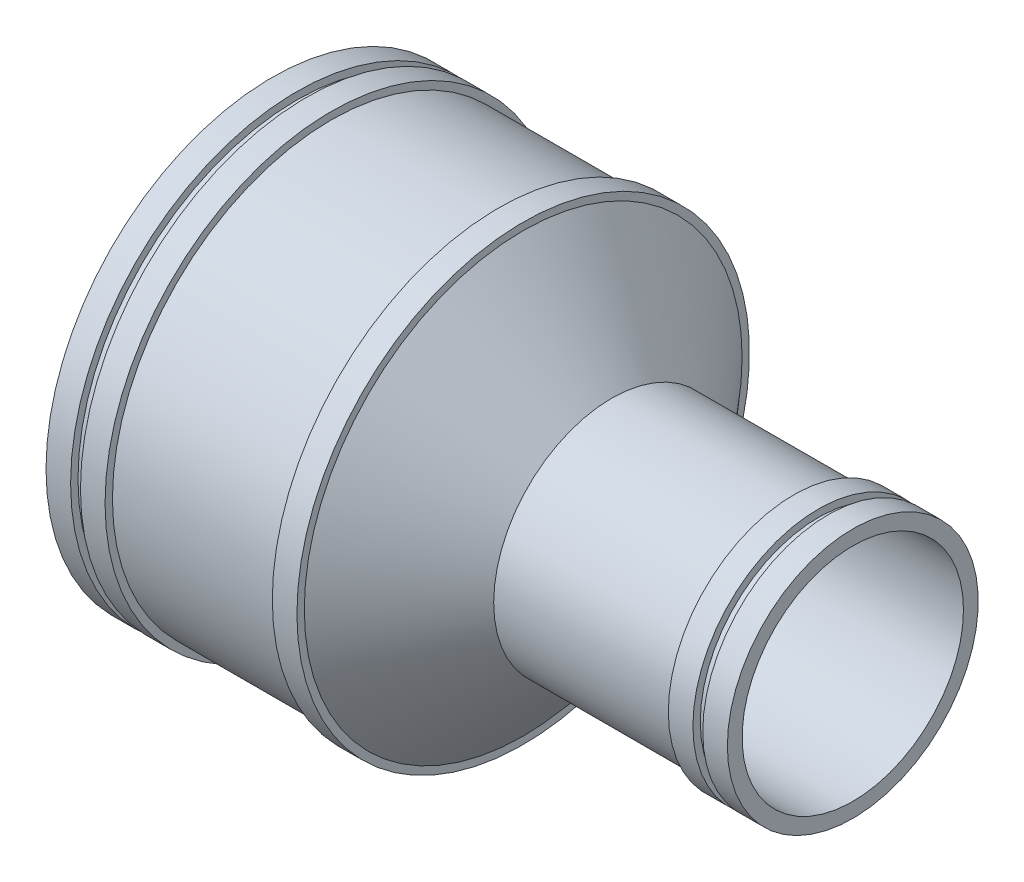
ISO-10303-21;
HEADER;
FILE_DESCRIPTION(('STEP AP214'),'2;1');
FILE_NAME('part.step','',(''),(''),'','','');
FILE_SCHEMA(('AUTOMOTIVE_DESIGN { 1 0 10303 214 1 1 1 1 }'));
ENDSEC;
DATA;
#1=APPLICATION_CONTEXT('core data for automotive mechanical design processes');
#2=APPLICATION_PROTOCOL_DEFINITION('international standard','automotive_design',2000,#1);
#3=PRODUCT_CONTEXT('',#1,'mechanical');
#4=PRODUCT('Part','Part','',(#3));
#5=PRODUCT_RELATED_PRODUCT_CATEGORY('part','',(#4));
#6=PRODUCT_DEFINITION_FORMATION('','',#4);
#7=PRODUCT_DEFINITION_CONTEXT('part definition',#1,'design');
#8=PRODUCT_DEFINITION('design','',#6,#7);
#9=PRODUCT_DEFINITION_SHAPE('','',#8);
#10=(LENGTH_UNIT() NAMED_UNIT(*) SI_UNIT(.MILLI.,.METRE.));
#11=(NAMED_UNIT(*) PLANE_ANGLE_UNIT() SI_UNIT($,.RADIAN.));
#12=(NAMED_UNIT(*) SI_UNIT($,.STERADIAN.) SOLID_ANGLE_UNIT());
#13=UNCERTAINTY_MEASURE_WITH_UNIT(LENGTH_MEASURE(1.E-05),#10,'distance_accuracy_value','');
#14=(GEOMETRIC_REPRESENTATION_CONTEXT(3) GLOBAL_UNCERTAINTY_ASSIGNED_CONTEXT((#13)) GLOBAL_UNIT_ASSIGNED_CONTEXT((#10,
#11,#12)) REPRESENTATION_CONTEXT('',''));
#15=CARTESIAN_POINT('',(0.,0.,0.));
#16=DIRECTION('',(0.,0.,1.));
#17=DIRECTION('',(1.,0.,0.));
#18=AXIS2_PLACEMENT_3D('',#15,#16,#17);
#19=CARTESIAN_POINT('',(118.,0.,0.));
#20=DIRECTION('',(-1.,0.,0.));
#21=DIRECTION('',(0.,0.,1.));
#22=AXIS2_PLACEMENT_3D('',#19,#20,#21);
#23=CYLINDRICAL_SURFACE('',#22,22.);
#24=CARTESIAN_POINT('',(69.,0.,0.));
#25=DIRECTION('',(-1.,0.,0.));
#26=DIRECTION('',(0.,0.,-1.));
#27=AXIS2_PLACEMENT_3D('',#24,#25,#26);
#28=CIRCLE('',#27,22.);
#29=CARTESIAN_POINT('',(69.,9.11626278185226,-20.0223313550699));
#30=VERTEX_POINT('',#29);
#31=EDGE_CURVE('E94',#30,#30,#28,.T.);
#32=ORIENTED_EDGE('',*,*,#31,.T.);
#33=EDGE_LOOP('',(#32));
#34=FACE_BOUND('',#33,.T.);
#35=CARTESIAN_POINT('',(79.,0.,0.));
#36=DIRECTION('',(1.,0.,0.));
#37=DIRECTION('',(0.,0.,-1.));
#38=AXIS2_PLACEMENT_3D('',#35,#36,#37);
#39=CIRCLE('',#38,22.);
#40=CARTESIAN_POINT('',(79.,0.,-22.));
#41=VERTEX_POINT('',#40);
#42=EDGE_CURVE('E46',#41,#41,#39,.T.);
#43=ORIENTED_EDGE('',*,*,#42,.T.);
#44=EDGE_LOOP('',(#43));
#45=FACE_BOUND('',#44,.T.);
#46=ADVANCED_FACE('F41',(#34,#45),#23,.F.);
#47=CARTESIAN_POINT('',(118.,0.,0.));
#48=DIRECTION('',(-1.,0.,0.));
#49=DIRECTION('',(0.,0.,1.));
#50=AXIS2_PLACEMENT_3D('',#47,#48,#49);
#51=CYLINDRICAL_SURFACE('',#50,24.);
#52=CARTESIAN_POINT('',(113.,0.,0.));
#53=DIRECTION('',(-1.,0.,0.));
#54=DIRECTION('',(0.,0.,1.));
#55=AXIS2_PLACEMENT_3D('',#52,#53,#54);
#56=CIRCLE('',#55,24.);
#57=CARTESIAN_POINT('',(113.,0.,24.));
#58=VERTEX_POINT('',#57);
#59=EDGE_CURVE('E217',#58,#58,#56,.T.);
#60=ORIENTED_EDGE('',*,*,#59,.T.);
#61=EDGE_LOOP('',(#60));
#62=FACE_BOUND('',#61,.T.);
#63=CARTESIAN_POINT('',(111.,0.,0.));
#64=DIRECTION('',(-1.,0.,0.));
#65=DIRECTION('',(0.,0.,1.));
#66=AXIS2_PLACEMENT_3D('',#63,#64,#65);
#67=CIRCLE('',#66,24.);
#68=CARTESIAN_POINT('',(111.,0.,24.));
#69=VERTEX_POINT('',#68);
#70=EDGE_CURVE('E238',#69,#69,#67,.T.);
#71=ORIENTED_EDGE('',*,*,#70,.F.);
#72=EDGE_LOOP('',(#71));
#73=FACE_BOUND('',#72,.T.);
#74=ADVANCED_FACE('F81',(#62,#73),#51,.T.);
#75=CARTESIAN_POINT('',(51.,0.,0.));
#76=DIRECTION('',(-1.,0.,0.));
#77=DIRECTION('',(0.,0.,1.));
#78=AXIS2_PLACEMENT_3D('',#75,#76,#77);
#79=CYLINDRICAL_SURFACE('',#78,44.5);
#80=CARTESIAN_POINT('',(46.,0.,0.));
#81=DIRECTION('',(-1.,0.,0.));
#82=DIRECTION('',(0.,0.,1.));
#83=AXIS2_PLACEMENT_3D('',#80,#81,#82);
#84=CIRCLE('',#83,44.5);
#85=CARTESIAN_POINT('',(46.,0.,44.5));
#86=VERTEX_POINT('',#85);
#87=EDGE_CURVE('E250',#86,#86,#84,.T.);
#88=ORIENTED_EDGE('',*,*,#87,.T.);
#89=EDGE_LOOP('',(#88));
#90=FACE_BOUND('',#89,.T.);
#91=CARTESIAN_POINT('',(12.,0.,0.));
#92=DIRECTION('',(-1.,0.,0.));
#93=DIRECTION('',(0.,0.,1.));
#94=AXIS2_PLACEMENT_3D('',#91,#92,#93);
#95=CIRCLE('',#94,44.5);
#96=CARTESIAN_POINT('',(12.,0.,44.5));
#97=VERTEX_POINT('',#96);
#98=EDGE_CURVE('E262',#97,#97,#95,.T.);
#99=ORIENTED_EDGE('',*,*,#98,.F.);
#100=EDGE_LOOP('',(#99));
#101=FACE_BOUND('',#100,.T.);
#102=ADVANCED_FACE('F282',(#90,#101),#79,.T.);
#103=CARTESIAN_POINT('',(51.,0.,0.));
#104=DIRECTION('',(-1.,0.,0.));
#105=DIRECTION('',(0.,0.,1.));
#106=AXIS2_PLACEMENT_3D('',#103,#104,#105);
#107=CYLINDRICAL_SURFACE('',#106,41.5);
#108=CARTESIAN_POINT('',(51.,0.,0.));
#109=DIRECTION('',(1.,0.,0.));
#110=DIRECTION('',(0.,0.,-1.));
#111=AXIS2_PLACEMENT_3D('',#108,#109,#110);
#112=CIRCLE('',#111,41.5);
#113=CARTESIAN_POINT('',(51.,27.3661185745552,-31.1984864082119));
#114=VERTEX_POINT('',#113);
#115=EDGE_CURVE('E55',#114,#114,#112,.T.);
#116=ORIENTED_EDGE('',*,*,#115,.T.);
#117=EDGE_LOOP('',(#116));
#118=FACE_BOUND('',#117,.T.);
#119=CARTESIAN_POINT('',(0.,0.,0.));
#120=DIRECTION('',(1.,0.,0.));
#121=DIRECTION('',(0.,0.,-1.));
#122=AXIS2_PLACEMENT_3D('',#119,#120,#121);
#123=CIRCLE('',#122,41.5);
#124=CARTESIAN_POINT('',(0.,0.,-41.5));
#125=VERTEX_POINT('',#124);
#126=EDGE_CURVE('E11',#125,#125,#123,.T.);
#127=ORIENTED_EDGE('',*,*,#126,.F.);
#128=EDGE_LOOP('',(#127));
#129=FACE_BOUND('',#128,.T.);
#130=ADVANCED_FACE('F43',(#118,#129),#107,.F.);
#131=CARTESIAN_POINT('',(5.,0.,0.));
#132=DIRECTION('',(-1.,0.,0.));
#133=DIRECTION('',(0.,0.,1.));
#134=AXIS2_PLACEMENT_3D('',#131,#132,#133);
#135=CIRCLE('',#134,44.5);
#136=CARTESIAN_POINT('',(5.,0.,44.5));
#137=VERTEX_POINT('',#136);
#138=EDGE_CURVE('E253',#137,#137,#135,.T.);
#139=ORIENTED_EDGE('',*,*,#138,.F.);
#140=EDGE_LOOP('',(#139));
#141=FACE_BOUND('',#140,.T.);
#142=CARTESIAN_POINT('',(7.,0.,0.));
#143=DIRECTION('',(-1.,0.,0.));
#144=DIRECTION('',(0.,0.,1.));
#145=AXIS2_PLACEMENT_3D('',#142,#143,#144);
#146=CIRCLE('',#145,44.5);
#147=CARTESIAN_POINT('',(7.,0.,44.5));
#148=VERTEX_POINT('',#147);
#149=EDGE_CURVE('E265',#148,#148,#146,.T.);
#150=ORIENTED_EDGE('',*,*,#149,.T.);
#151=EDGE_LOOP('',(#150));
#152=FACE_BOUND('',#151,.T.);
#153=ADVANCED_FACE('F278',(#141,#152),#79,.T.);
#154=CARTESIAN_POINT('',(0.,0.,0.));
#155=DIRECTION('',(1.,0.,0.));
#156=DIRECTION('',(0.,0.,-1.));
#157=AXIS2_PLACEMENT_3D('',#154,#155,#156);
#158=PLANE('',#157);
#159=ORIENTED_EDGE('',*,*,#126,.T.);
#160=EDGE_LOOP('',(#159));
#161=FACE_BOUND('',#160,.T.);
#162=CARTESIAN_POINT('',(0.,0.,0.));
#163=DIRECTION('',(-1.,0.,0.));
#164=DIRECTION('',(0.,0.,1.));
#165=AXIS2_PLACEMENT_3D('',#162,#163,#164);
#166=CIRCLE('',#165,46.);
#167=CARTESIAN_POINT('',(0.,0.,46.));
#168=VERTEX_POINT('',#167);
#169=EDGE_CURVE('E256',#168,#168,#166,.T.);
#170=ORIENTED_EDGE('',*,*,#169,.T.);
#171=EDGE_LOOP('',(#170));
#172=FACE_BOUND('',#171,.T.);
#173=ADVANCED_FACE('F280',(#161,#172),#158,.F.);
#174=CARTESIAN_POINT('',(69.,0.,0.));
#175=DIRECTION('',(-1.,0.,0.));
#176=DIRECTION('',(0.,0.,1.));
#177=AXIS2_PLACEMENT_3D('',#174,#175,#176);
#178=CONICAL_SURFACE('',#177,24.,0.850242190950655);
#179=CARTESIAN_POINT('',(51.,0.,0.));
#180=DIRECTION('',(-1.,0.,0.));
#181=DIRECTION('',(0.,0.,1.));
#182=AXIS2_PLACEMENT_3D('',#179,#180,#181);
#183=CIRCLE('',#182,44.5);
#184=CARTESIAN_POINT('',(51.,0.,44.5));
#185=VERTEX_POINT('',#184);
#186=EDGE_CURVE('E247',#185,#185,#183,.T.);
#187=ORIENTED_EDGE('',*,*,#186,.F.);
#188=EDGE_LOOP('',(#187));
#189=FACE_BOUND('',#188,.T.);
#190=CARTESIAN_POINT('',(69.,0.,0.));
#191=DIRECTION('',(1.,0.,0.));
#192=DIRECTION('',(0.,0.,-1.));
#193=AXIS2_PLACEMENT_3D('',#190,#191,#192);
#194=CIRCLE('',#193,24.);
#195=CARTESIAN_POINT('',(69.,0.,-24.));
#196=VERTEX_POINT('',#195);
#197=EDGE_CURVE('E50',#196,#196,#194,.T.);
#198=ORIENTED_EDGE('',*,*,#197,.F.);
#199=EDGE_LOOP('',(#198));
#200=FACE_BOUND('',#199,.T.);
#201=ADVANCED_FACE('F79',(#189,#200),#178,.T.);
#202=CARTESIAN_POINT('',(106.,0.,0.));
#203=DIRECTION('',(-1.,0.,0.));
#204=DIRECTION('',(0.,0.,1.));
#205=AXIS2_PLACEMENT_3D('',#202,#203,#204);
#206=CIRCLE('',#205,24.);
#207=CARTESIAN_POINT('',(106.,0.,24.));
#208=VERTEX_POINT('',#207);
#209=EDGE_CURVE('E229',#208,#208,#206,.T.);
#210=ORIENTED_EDGE('',*,*,#209,.T.);
#211=EDGE_LOOP('',(#210));
#212=FACE_BOUND('',#211,.T.);
#213=ORIENTED_EDGE('',*,*,#197,.T.);
#214=EDGE_LOOP('',(#213));
#215=FACE_BOUND('',#214,.T.);
#216=ADVANCED_FACE('F68',(#212,#215),#51,.T.);
#217=CARTESIAN_POINT('',(118.,0.,0.));
#218=DIRECTION('',(1.,0.,0.));
#219=DIRECTION('',(0.,0.,-1.));
#220=AXIS2_PLACEMENT_3D('',#217,#218,#219);
#221=PLANE('',#220);
#222=CARTESIAN_POINT('',(118.,0.,0.));
#223=DIRECTION('',(1.,0.,0.));
#224=DIRECTION('',(0.,0.,-1.));
#225=AXIS2_PLACEMENT_3D('',#222,#223,#224);
#226=CIRCLE('',#225,22.5);
#227=CARTESIAN_POINT('',(118.,0.,-22.5));
#228=VERTEX_POINT('',#227);
#229=EDGE_CURVE('E215',#228,#228,#226,.T.);
#230=ORIENTED_EDGE('',*,*,#229,.F.);
#231=EDGE_LOOP('',(#230));
#232=FACE_BOUND('',#231,.T.);
#233=CARTESIAN_POINT('',(118.,0.,0.));
#234=DIRECTION('',(-1.,0.,0.));
#235=DIRECTION('',(0.,0.,1.));
#236=AXIS2_PLACEMENT_3D('',#233,#234,#235);
#237=CIRCLE('',#236,25.5);
#238=CARTESIAN_POINT('',(118.,0.,25.5));
#239=VERTEX_POINT('',#238);
#240=EDGE_CURVE('E226',#239,#239,#237,.T.);
#241=ORIENTED_EDGE('',*,*,#240,.F.);
#242=EDGE_LOOP('',(#241));
#243=FACE_BOUND('',#242,.T.);
#244=ADVANCED_FACE('F78',(#232,#243),#221,.T.);
#245=CARTESIAN_POINT('',(69.,9.11626278185226,-20.0223313550699));
#246=CARTESIAN_POINT('',(51.,27.3661185745552,-31.1984864082119));
#247=CARTESIAN_POINT('',(69.,-30.9283999282875,-38.2548569187744));
#248=CARTESIAN_POINT('',(51.,-35.0308542418687,-85.9307235573223));
#249=CARTESIAN_POINT('',(69.,-49.1609254919921,1.7898057913654));
#250=CARTESIAN_POINT('',(51.,-89.7630913909791,-23.5337507408984));
#251=CARTESIAN_POINT('',(69.,-9.11626278185225,20.0223313550699));
#252=CARTESIAN_POINT('',(51.,-27.3661185745552,31.198486408212));
#253=CARTESIAN_POINT('',(69.,30.9283999282875,38.2548569187744));
#254=CARTESIAN_POINT('',(51.,35.0308542418687,85.9307235573223));
#255=CARTESIAN_POINT('',(69.,49.1609254919921,-1.78980579136539));
#256=CARTESIAN_POINT('',(51.,89.7630913909791,23.5337507408984));
#257=CARTESIAN_POINT('',(69.,9.11626278185226,-20.0223313550699));
#258=CARTESIAN_POINT('',(51.,27.3661185745552,-31.1984864082119));
#259=(BOUNDED_SURFACE() B_SPLINE_SURFACE(3,1,((#245,#246),(#247,#248),(#249,#250),(#251,#252),
(#253,#254),(#255,#256),(#257,#258)),.UNSPECIFIED.,.T.,.F.,.F.) B_SPLINE_SURFACE_WITH_KNOTS((4,
3,4),(2,2),(0.,0.5,1.),(0.,1.),
.UNSPECIFIED.) GEOMETRIC_REPRESENTATION_ITEM() RATIONAL_B_SPLINE_SURFACE(((1.,1.),
(0.333333333333333,0.333333333333333),(0.333333333333333,0.333333333333333),(1.,1.),
(0.333333333333333,0.333333333333333),(0.333333333333333,0.333333333333333),(1.,1.))) REPRESENTATION_ITEM('') SURFACE());
#260=CARTESIAN_POINT('',(69.,9.11626278185226,-20.0223313550699));
#261=CARTESIAN_POINT('',(68.8125,9.30636544635958,-20.1387496368735));
#262=CARTESIAN_POINT('',(68.625,9.4964681108669,-20.255167918677));
#263=CARTESIAN_POINT('',(68.25,9.87667343988154,-20.4880044822842));
#264=CARTESIAN_POINT('',(68.0625,10.0667761043889,-20.6044227640877));
#265=CARTESIAN_POINT('',(67.6875,10.4469814334035,-20.8372593276948));
#266=CARTESIAN_POINT('',(67.5,10.6370840979108,-20.9536776094984));
#267=CARTESIAN_POINT('',(67.125,11.0172894269255,-21.1865141731055));
#268=CARTESIAN_POINT('',(66.9375,11.2073920914328,-21.3029324549091));
#269=CARTESIAN_POINT('',(66.5625,11.5875974204474,-21.5357690185162));
#270=CARTESIAN_POINT('',(66.375,11.7777000849548,-21.6521873003198));
#271=CARTESIAN_POINT('',(66.,12.1579054139694,-21.8850238639269));
#272=CARTESIAN_POINT('',(65.8125,12.3480080784767,-22.0014421457305));
#273=CARTESIAN_POINT('',(65.4375,12.7282134074914,-22.2342787093376));
#274=CARTESIAN_POINT('',(65.25,12.9183160719987,-22.3506969911412));
#275=CARTESIAN_POINT('',(64.875,13.2985214010133,-22.5835335547483));
#276=CARTESIAN_POINT('',(64.6875,13.4886240655207,-22.6999518365518));
#277=CARTESIAN_POINT('',(64.3125,13.8688293945353,-22.932788400159));
#278=CARTESIAN_POINT('',(64.125,14.0589320590426,-23.0492066819625));
#279=CARTESIAN_POINT('',(63.75,14.4391373880573,-23.2820432455697));
#280=CARTESIAN_POINT('',(63.5625,14.6292400525646,-23.3984615273732));
#281=CARTESIAN_POINT('',(63.1875,15.0094453815792,-23.6312980909804));
#282=CARTESIAN_POINT('',(63.,15.1995480460866,-23.7477163727839));
#283=CARTESIAN_POINT('',(62.625,15.5797533751012,-23.980552936391));
#284=CARTESIAN_POINT('',(62.4375,15.7698560396085,-24.0969712181946));
#285=CARTESIAN_POINT('',(62.0625,16.1500613686232,-24.3298077818017));
#286=CARTESIAN_POINT('',(61.875,16.3401640331305,-24.4462260636053));
#287=CARTESIAN_POINT('',(61.5,16.7203693621451,-24.6790626272124));
#288=CARTESIAN_POINT('',(61.3125,16.9104720266525,-24.795480909016));
#289=CARTESIAN_POINT('',(60.9375,17.2906773556671,-25.0283174726231));
#290=CARTESIAN_POINT('',(60.75,17.4807800201744,-25.1447357544267));
#291=CARTESIAN_POINT('',(60.375,17.8609853491891,-25.3775723180338));
#292=CARTESIAN_POINT('',(60.1875,18.0510880136964,-25.4939905998374));
#293=CARTESIAN_POINT('',(59.8125,18.431293342711,-25.7268271634445));
#294=CARTESIAN_POINT('',(59.625,18.6213960072184,-25.8432454452481));
#295=CARTESIAN_POINT('',(59.25,19.001601336233,-26.0760820088552));
#296=CARTESIAN_POINT('',(59.0625,19.1917040007403,-26.1925002906587));
#297=CARTESIAN_POINT('',(58.6875,19.571909329755,-26.4253368542659));
#298=CARTESIAN_POINT('',(58.5,19.7620119942623,-26.5417551360694));
#299=CARTESIAN_POINT('',(58.125,20.1422173232769,-26.7745916996766));
#300=CARTESIAN_POINT('',(57.9375,20.3323199877843,-26.8910099814801));
#301=CARTESIAN_POINT('',(57.5625,20.7125253167989,-27.1238465450872));
#302=CARTESIAN_POINT('',(57.375,20.9026279813062,-27.2402648268908));
#303=CARTESIAN_POINT('',(57.,21.2828333103209,-27.4731013904979));
#304=CARTESIAN_POINT('',(56.8125,21.4729359748282,-27.5895196723015));
#305=CARTESIAN_POINT('',(56.4375,21.8531413038428,-27.8223562359086));
#306=CARTESIAN_POINT('',(56.25,22.0432439683502,-27.9387745177122));
#307=CARTESIAN_POINT('',(55.875,22.4234492973648,-28.1716110813193));
#308=CARTESIAN_POINT('',(55.6875,22.6135519618721,-28.2880293631229));
#309=CARTESIAN_POINT('',(55.3125,22.9937572908868,-28.52086592673));
#310=CARTESIAN_POINT('',(55.125,23.1838599553941,-28.6372842085336));
#311=CARTESIAN_POINT('',(54.75,23.5640652844087,-28.8701207721407));
#312=CARTESIAN_POINT('',(54.5625,23.7541679489161,-28.9865390539443));
#313=CARTESIAN_POINT('',(54.1875,24.1343732779307,-29.2193756175514));
#314=CARTESIAN_POINT('',(54.,24.324475942438,-29.3357938993549));
#315=CARTESIAN_POINT('',(53.625,24.7046812714527,-29.5686304629621));
#316=CARTESIAN_POINT('',(53.4375,24.89478393596,-29.6850487447656));
#317=CARTESIAN_POINT('',(53.0625,25.2749892649746,-29.9178853083728));
#318=CARTESIAN_POINT('',(52.875,25.465091929482,-30.0343035901763));
#319=CARTESIAN_POINT('',(52.5,25.8452972584966,-30.2671401537834));
#320=CARTESIAN_POINT('',(52.3125,26.0353999230039,-30.383558435587));
#321=CARTESIAN_POINT('',(51.9375,26.4156052520186,-30.6163949991941));
#322=CARTESIAN_POINT('',(51.75,26.6057079165259,-30.7328132809977));
#323=CARTESIAN_POINT('',(51.375,26.9859132455406,-30.9656498446048));
#324=CARTESIAN_POINT('',(51.1875,27.1760159100479,-31.0820681264084));
#325=CARTESIAN_POINT('',(51.,27.3661185745552,-31.1984864082119));
#326=B_SPLINE_CURVE_WITH_KNOTS('',3,(#260,#261,#262,#263,#264,#265,#266,#267,#268,#269,#270,
#271,#272,#273,#274,#275,#276,#277,#278,#279,#280,#281,#282,#283,#284,#285,#286,#287,#288,#289,
#290,#291,#292,#293,#294,#295,#296,#297,#298,#299,#300,#301,#302,#303,#304,#305,#306,#307,#308,
#309,#310,#311,#312,#313,#314,#315,#316,#317,#318,#319,#320,#321,#322,#323,#324,#325),
.UNSPECIFIED.,.F.,.F.,(4,2,2,2,2,2,2,2,2,2,2,2,2,2,2,2,2,2,2,2,2,2,2,2,2,2,2,2,2,2,2,2,4),(0.,
0.873862920896573,1.74772584179315,2.62158876268973,3.49545168358631,4.36931460448288,
5.24317752537946,6.11704044627604,6.99090336717261,7.86476628806918,8.73862920896576,
9.61249212986235,10.4863550507589,11.3602179716555,12.2340808925521,13.1079438134487,
13.9818067343452,14.8556696552418,15.7295325761384,16.603395497035,17.4772584179315,
18.3511213388281,19.2249842597247,20.0988471806213,20.9727101015178,21.8465730224144,
22.720435943311,23.5942988642076,24.4681617851041,25.3420247060007,26.2158876268973,
27.0897505477939,27.9636134686905),.UNSPECIFIED.);
#327=EDGE_CURVE('BSEAM124',#30,#114,#326,.T.);
#328=ORIENTED_EDGE('',*,*,#31,.F.);
#329=ORIENTED_EDGE('',*,*,#115,.F.);
#330=ORIENTED_EDGE('',*,*,#327,.T.);
#331=ORIENTED_EDGE('',*,*,#327,.F.);
#332=EDGE_LOOP('',(#328,#330,#329,#331));
#333=FACE_BOUND('',#332,.T.);
#334=ADVANCED_FACE('F124',(#333),#259,.F.);
#335=CARTESIAN_POINT('',(12.,0.,0.));
#336=DIRECTION('',(1.,0.,0.));
#337=DIRECTION('',(0.,0.,-1.));
#338=AXIS2_PLACEMENT_3D('',#335,#336,#337);
#339=PLANE('',#338);
#340=ORIENTED_EDGE('',*,*,#98,.T.);
#341=EDGE_LOOP('',(#340));
#342=FACE_BOUND('',#341,.T.);
#343=CARTESIAN_POINT('',(12.,0.,0.));
#344=DIRECTION('',(-1.,0.,0.));
#345=DIRECTION('',(0.,0.,1.));
#346=AXIS2_PLACEMENT_3D('',#343,#344,#345);
#347=CIRCLE('',#346,46.);
#348=CARTESIAN_POINT('',(12.,0.,46.));
#349=VERTEX_POINT('',#348);
#350=EDGE_CURVE('E102',#349,#349,#347,.T.);
#351=ORIENTED_EDGE('',*,*,#350,.F.);
#352=EDGE_LOOP('',(#351));
#353=FACE_BOUND('',#352,.T.);
#354=ADVANCED_FACE('F141',(#342,#353),#339,.T.);
#355=CARTESIAN_POINT('',(0.,0.,0.));
#356=DIRECTION('',(-1.,0.,0.));
#357=DIRECTION('',(0.,0.,1.));
#358=AXIS2_PLACEMENT_3D('',#355,#356,#357);
#359=CYLINDRICAL_SURFACE('',#358,46.);
#360=ORIENTED_EDGE('',*,*,#350,.T.);
#361=EDGE_LOOP('',(#360));
#362=FACE_BOUND('',#361,.T.);
#363=CARTESIAN_POINT('',(7.,0.,0.));
#364=DIRECTION('',(-1.,0.,0.));
#365=DIRECTION('',(0.,0.,1.));
#366=AXIS2_PLACEMENT_3D('',#363,#364,#365);
#367=CIRCLE('',#366,46.);
#368=CARTESIAN_POINT('',(7.,0.,46.));
#369=VERTEX_POINT('',#368);
#370=EDGE_CURVE('E268',#369,#369,#367,.T.);
#371=ORIENTED_EDGE('',*,*,#370,.F.);
#372=EDGE_LOOP('',(#371));
#373=FACE_BOUND('',#372,.T.);
#374=ADVANCED_FACE('F151',(#362,#373),#359,.T.);
#375=CARTESIAN_POINT('',(7.,0.,0.));
#376=DIRECTION('',(-1.,0.,0.));
#377=DIRECTION('',(0.,0.,1.));
#378=AXIS2_PLACEMENT_3D('',#375,#376,#377);
#379=PLANE('',#378);
#380=ORIENTED_EDGE('',*,*,#370,.T.);
#381=EDGE_LOOP('',(#380));
#382=FACE_BOUND('',#381,.T.);
#383=ORIENTED_EDGE('',*,*,#149,.F.);
#384=EDGE_LOOP('',(#383));
#385=FACE_BOUND('',#384,.T.);
#386=ADVANCED_FACE('F155',(#382,#385),#379,.T.);
#387=CARTESIAN_POINT('',(5.,0.,0.));
#388=DIRECTION('',(1.,0.,0.));
#389=DIRECTION('',(0.,0.,-1.));
#390=AXIS2_PLACEMENT_3D('',#387,#388,#389);
#391=PLANE('',#390);
#392=ORIENTED_EDGE('',*,*,#138,.T.);
#393=EDGE_LOOP('',(#392));
#394=FACE_BOUND('',#393,.T.);
#395=CARTESIAN_POINT('',(5.,0.,0.));
#396=DIRECTION('',(-1.,0.,0.));
#397=DIRECTION('',(0.,0.,1.));
#398=AXIS2_PLACEMENT_3D('',#395,#396,#397);
#399=CIRCLE('',#398,46.);
#400=CARTESIAN_POINT('',(5.,0.,46.));
#401=VERTEX_POINT('',#400);
#402=EDGE_CURVE('E259',#401,#401,#399,.T.);
#403=ORIENTED_EDGE('',*,*,#402,.F.);
#404=EDGE_LOOP('',(#403));
#405=FACE_BOUND('',#404,.T.);
#406=ADVANCED_FACE('F159',(#394,#405),#391,.T.);
#407=CARTESIAN_POINT('',(0.,0.,0.));
#408=DIRECTION('',(-1.,0.,0.));
#409=DIRECTION('',(0.,0.,1.));
#410=AXIS2_PLACEMENT_3D('',#407,#408,#409);
#411=CYLINDRICAL_SURFACE('',#410,46.);
#412=ORIENTED_EDGE('',*,*,#402,.T.);
#413=EDGE_LOOP('',(#412));
#414=FACE_BOUND('',#413,.T.);
#415=ORIENTED_EDGE('',*,*,#169,.F.);
#416=EDGE_LOOP('',(#415));
#417=FACE_BOUND('',#416,.T.);
#418=ADVANCED_FACE('F163',(#414,#417),#411,.T.);
#419=CARTESIAN_POINT('',(46.,0.,0.));
#420=DIRECTION('',(-1.,0.,0.));
#421=DIRECTION('',(0.,0.,1.));
#422=AXIS2_PLACEMENT_3D('',#419,#420,#421);
#423=PLANE('',#422);
#424=CARTESIAN_POINT('',(46.,0.,0.));
#425=DIRECTION('',(-1.,0.,0.));
#426=DIRECTION('',(0.,0.,1.));
#427=AXIS2_PLACEMENT_3D('',#424,#425,#426);
#428=CIRCLE('',#427,46.);
#429=CARTESIAN_POINT('',(46.,0.,46.));
#430=VERTEX_POINT('',#429);
#431=EDGE_CURVE('E241',#430,#430,#428,.T.);
#432=ORIENTED_EDGE('',*,*,#431,.T.);
#433=EDGE_LOOP('',(#432));
#434=FACE_BOUND('',#433,.T.);
#435=ORIENTED_EDGE('',*,*,#87,.F.);
#436=EDGE_LOOP('',(#435));
#437=FACE_BOUND('',#436,.T.);
#438=ADVANCED_FACE('F167',(#434,#437),#423,.T.);
#439=CARTESIAN_POINT('',(51.,0.,0.));
#440=DIRECTION('',(-1.,0.,0.));
#441=DIRECTION('',(0.,0.,1.));
#442=AXIS2_PLACEMENT_3D('',#439,#440,#441);
#443=PLANE('',#442);
#444=CARTESIAN_POINT('',(51.,0.,0.));
#445=DIRECTION('',(-1.,0.,0.));
#446=DIRECTION('',(0.,0.,1.));
#447=AXIS2_PLACEMENT_3D('',#444,#445,#446);
#448=CIRCLE('',#447,46.);
#449=CARTESIAN_POINT('',(51.,0.,46.));
#450=VERTEX_POINT('',#449);
#451=EDGE_CURVE('E244',#450,#450,#448,.T.);
#452=ORIENTED_EDGE('',*,*,#451,.F.);
#453=EDGE_LOOP('',(#452));
#454=FACE_BOUND('',#453,.T.);
#455=ORIENTED_EDGE('',*,*,#186,.T.);
#456=EDGE_LOOP('',(#455));
#457=FACE_BOUND('',#456,.T.);
#458=ADVANCED_FACE('F171',(#454,#457),#443,.F.);
#459=CARTESIAN_POINT('',(0.,0.,0.));
#460=DIRECTION('',(-1.,0.,0.));
#461=DIRECTION('',(0.,0.,1.));
#462=AXIS2_PLACEMENT_3D('',#459,#460,#461);
#463=CYLINDRICAL_SURFACE('',#462,46.);
#464=ORIENTED_EDGE('',*,*,#431,.F.);
#465=EDGE_LOOP('',(#464));
#466=FACE_BOUND('',#465,.T.);
#467=ORIENTED_EDGE('',*,*,#451,.T.);
#468=EDGE_LOOP('',(#467));
#469=FACE_BOUND('',#468,.T.);
#470=ADVANCED_FACE('F175',(#466,#469),#463,.T.);
#471=CARTESIAN_POINT('',(111.,1.02695629777826E-12,0.));
#472=DIRECTION('',(1.,0.,0.));
#473=DIRECTION('',(0.,0.,-1.));
#474=AXIS2_PLACEMENT_3D('',#471,#472,#473);
#475=PLANE('',#474);
#476=ORIENTED_EDGE('',*,*,#70,.T.);
#477=EDGE_LOOP('',(#476));
#478=FACE_BOUND('',#477,.T.);
#479=CARTESIAN_POINT('',(111.,0.,0.));
#480=DIRECTION('',(-1.,0.,0.));
#481=DIRECTION('',(0.,0.,1.));
#482=AXIS2_PLACEMENT_3D('',#479,#480,#481);
#483=CIRCLE('',#482,25.5);
#484=CARTESIAN_POINT('',(111.,0.,25.5));
#485=VERTEX_POINT('',#484);
#486=EDGE_CURVE('E235',#485,#485,#483,.T.);
#487=ORIENTED_EDGE('',*,*,#486,.F.);
#488=EDGE_LOOP('',(#487));
#489=FACE_BOUND('',#488,.T.);
#490=ADVANCED_FACE('F179',(#478,#489),#475,.T.);
#491=CARTESIAN_POINT('',(0.,0.,0.));
#492=DIRECTION('',(-1.,0.,0.));
#493=DIRECTION('',(0.,0.,1.));
#494=AXIS2_PLACEMENT_3D('',#491,#492,#493);
#495=CYLINDRICAL_SURFACE('',#494,25.5);
#496=ORIENTED_EDGE('',*,*,#486,.T.);
#497=EDGE_LOOP('',(#496));
#498=FACE_BOUND('',#497,.T.);
#499=CARTESIAN_POINT('',(106.,0.,0.));
#500=DIRECTION('',(-1.,0.,0.));
#501=DIRECTION('',(0.,0.,1.));
#502=AXIS2_PLACEMENT_3D('',#499,#500,#501);
#503=CIRCLE('',#502,25.5);
#504=CARTESIAN_POINT('',(106.,0.,25.5));
#505=VERTEX_POINT('',#504);
#506=EDGE_CURVE('E232',#505,#505,#503,.T.);
#507=ORIENTED_EDGE('',*,*,#506,.F.);
#508=EDGE_LOOP('',(#507));
#509=FACE_BOUND('',#508,.T.);
#510=ADVANCED_FACE('F183',(#498,#509),#495,.T.);
#511=CARTESIAN_POINT('',(106.,0.,0.));
#512=DIRECTION('',(-1.,0.,0.));
#513=DIRECTION('',(0.,0.,1.));
#514=AXIS2_PLACEMENT_3D('',#511,#512,#513);
#515=PLANE('',#514);
#516=ORIENTED_EDGE('',*,*,#506,.T.);
#517=EDGE_LOOP('',(#516));
#518=FACE_BOUND('',#517,.T.);
#519=ORIENTED_EDGE('',*,*,#209,.F.);
#520=EDGE_LOOP('',(#519));
#521=FACE_BOUND('',#520,.T.);
#522=ADVANCED_FACE('F187',(#518,#521),#515,.T.);
#523=CARTESIAN_POINT('',(0.,0.,0.));
#524=DIRECTION('',(-1.,0.,0.));
#525=DIRECTION('',(0.,0.,1.));
#526=AXIS2_PLACEMENT_3D('',#523,#524,#525);
#527=CYLINDRICAL_SURFACE('',#526,25.5);
#528=ORIENTED_EDGE('',*,*,#240,.T.);
#529=EDGE_LOOP('',(#528));
#530=FACE_BOUND('',#529,.T.);
#531=CARTESIAN_POINT('',(113.,0.,0.));
#532=DIRECTION('',(-1.,0.,0.));
#533=DIRECTION('',(0.,0.,1.));
#534=AXIS2_PLACEMENT_3D('',#531,#532,#533);
#535=CIRCLE('',#534,25.5);
#536=CARTESIAN_POINT('',(113.,0.,25.5));
#537=VERTEX_POINT('',#536);
#538=EDGE_CURVE('E223',#537,#537,#535,.T.);
#539=ORIENTED_EDGE('',*,*,#538,.F.);
#540=EDGE_LOOP('',(#539));
#541=FACE_BOUND('',#540,.T.);
#542=ADVANCED_FACE('F191',(#530,#541),#527,.T.);
#543=CARTESIAN_POINT('',(113.,-1.04546001485535E-12,0.));
#544=DIRECTION('',(-1.,0.,0.));
#545=DIRECTION('',(0.,0.,1.));
#546=AXIS2_PLACEMENT_3D('',#543,#544,#545);
#547=PLANE('',#546);
#548=ORIENTED_EDGE('',*,*,#538,.T.);
#549=EDGE_LOOP('',(#548));
#550=FACE_BOUND('',#549,.T.);
#551=ORIENTED_EDGE('',*,*,#59,.F.);
#552=EDGE_LOOP('',(#551));
#553=FACE_BOUND('',#552,.T.);
#554=ADVANCED_FACE('F195',(#550,#553),#547,.T.);
#555=CARTESIAN_POINT('',(79.,0.,0.));
#556=DIRECTION('',(1.,0.,0.));
#557=DIRECTION('',(0.,0.,-1.));
#558=AXIS2_PLACEMENT_3D('',#555,#556,#557);
#559=CYLINDRICAL_SURFACE('',#558,22.5);
#560=CARTESIAN_POINT('',(79.,0.,0.));
#561=DIRECTION('',(1.,0.,0.));
#562=DIRECTION('',(0.,0.,-1.));
#563=AXIS2_PLACEMENT_3D('',#560,#561,#562);
#564=CIRCLE('',#563,22.5);
#565=CARTESIAN_POINT('',(79.,0.,-22.5));
#566=VERTEX_POINT('',#565);
#567=EDGE_CURVE('E214',#566,#566,#564,.T.);
#568=ORIENTED_EDGE('',*,*,#567,.F.);
#569=EDGE_LOOP('',(#568));
#570=FACE_BOUND('',#569,.T.);
#571=ORIENTED_EDGE('',*,*,#229,.T.);
#572=EDGE_LOOP('',(#571));
#573=FACE_BOUND('',#572,.T.);
#574=ADVANCED_FACE('F199',(#570,#573),#559,.F.);
#575=CARTESIAN_POINT('',(79.,0.,0.));
#576=DIRECTION('',(1.,0.,0.));
#577=DIRECTION('',(0.,0.,-1.));
#578=AXIS2_PLACEMENT_3D('',#575,#576,#577);
#579=PLANE('',#578);
#580=ORIENTED_EDGE('',*,*,#42,.F.);
#581=EDGE_LOOP('',(#580));
#582=FACE_BOUND('',#581,.T.);
#583=ORIENTED_EDGE('',*,*,#567,.T.);
#584=EDGE_LOOP('',(#583));
#585=FACE_BOUND('',#584,.T.);
#586=ADVANCED_FACE('F203',(#582,#585),#579,.T.);
#587=CLOSED_SHELL('',(#46,#74,#102,#130,#153,#173,#201,#216,#244,#334,#354,#374,#386,#406,#418,
#438,#458,#470,#490,#510,#522,#542,#554,#574,#586));
#588=MANIFOLD_SOLID_BREP('B2',#587);
#589=ADVANCED_BREP_SHAPE_REPRESENTATION('',(#18,#588),#14);
#590=SHAPE_DEFINITION_REPRESENTATION(#9,#589);
ENDSEC;
END-ISO-10303-21;
